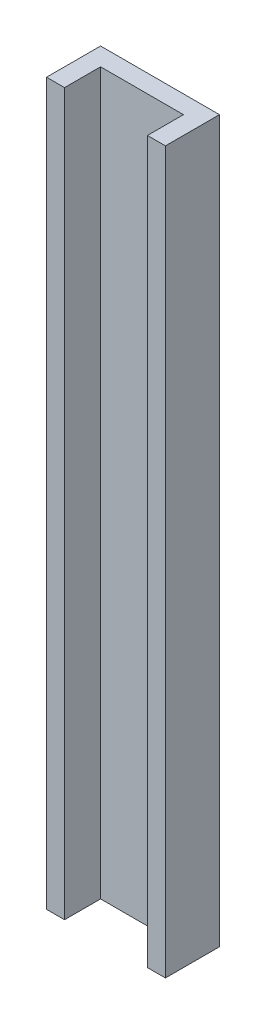
ISO-10303-21;
HEADER;
FILE_DESCRIPTION(('STEP AP214'),'2;1');
FILE_NAME('part.step','',(''),(''),'','','');
FILE_SCHEMA(('AUTOMOTIVE_DESIGN { 1 0 10303 214 1 1 1 1 }'));
ENDSEC;
DATA;
#1=APPLICATION_CONTEXT('core data for automotive mechanical design processes');
#2=APPLICATION_PROTOCOL_DEFINITION('international standard','automotive_design',2000,#1);
#3=PRODUCT_CONTEXT('',#1,'mechanical');
#4=PRODUCT('Part','Part','',(#3));
#5=PRODUCT_RELATED_PRODUCT_CATEGORY('part','',(#4));
#6=PRODUCT_DEFINITION_FORMATION('','',#4);
#7=PRODUCT_DEFINITION_CONTEXT('part definition',#1,'design');
#8=PRODUCT_DEFINITION('design','',#6,#7);
#9=PRODUCT_DEFINITION_SHAPE('','',#8);
#10=(LENGTH_UNIT() NAMED_UNIT(*) SI_UNIT(.MILLI.,.METRE.));
#11=(NAMED_UNIT(*) PLANE_ANGLE_UNIT() SI_UNIT($,.RADIAN.));
#12=(NAMED_UNIT(*) SI_UNIT($,.STERADIAN.) SOLID_ANGLE_UNIT());
#13=UNCERTAINTY_MEASURE_WITH_UNIT(LENGTH_MEASURE(1.E-05),#10,'distance_accuracy_value','');
#14=(GEOMETRIC_REPRESENTATION_CONTEXT(3) GLOBAL_UNCERTAINTY_ASSIGNED_CONTEXT((#13)) GLOBAL_UNIT_ASSIGNED_CONTEXT((#10,
#11,#12)) REPRESENTATION_CONTEXT('',''));
#15=CARTESIAN_POINT('',(0.,0.,0.));
#16=DIRECTION('',(0.,0.,1.));
#17=DIRECTION('',(1.,0.,0.));
#18=AXIS2_PLACEMENT_3D('',#15,#16,#17);
#19=CARTESIAN_POINT('',(0.,0.,5.));
#20=DIRECTION('',(0.,0.,-1.));
#21=DIRECTION('',(-1.,0.,0.));
#22=AXIS2_PLACEMENT_3D('',#19,#20,#21);
#23=PLANE('',#22);
#24=DIRECTION('',(0.,-1.,0.));
#25=VECTOR('',#24,1.);
#26=CARTESIAN_POINT('',(11.5,100.,5.));
#27=LINE('',#26,#25);
#28=CARTESIAN_POINT('',(11.5,100.,5.));
#29=VERTEX_POINT('',#28);
#30=CARTESIAN_POINT('',(11.5,-100.,5.));
#31=VERTEX_POINT('',#30);
#32=EDGE_CURVE('E55',#29,#31,#27,.T.);
#33=ORIENTED_EDGE('',*,*,#32,.F.);
#34=DIRECTION('',(-1.,0.,0.));
#35=VECTOR('',#34,1.);
#36=CARTESIAN_POINT('',(-16.5,100.,5.));
#37=LINE('',#36,#35);
#38=CARTESIAN_POINT('',(-11.5,100.,5.));
#39=VERTEX_POINT('',#38);
#40=EDGE_CURVE('E165',#29,#39,#37,.T.);
#41=ORIENTED_EDGE('',*,*,#40,.T.);
#42=DIRECTION('',(0.,1.,0.));
#43=VECTOR('',#42,1.);
#44=CARTESIAN_POINT('',(-11.5,100.,5.));
#45=LINE('',#44,#43);
#46=CARTESIAN_POINT('',(-11.5,-100.,5.));
#47=VERTEX_POINT('',#46);
#48=EDGE_CURVE('E139',#47,#39,#45,.T.);
#49=ORIENTED_EDGE('',*,*,#48,.F.);
#50=DIRECTION('',(1.,0.,0.));
#51=VECTOR('',#50,1.);
#52=CARTESIAN_POINT('',(-16.5,-100.,5.));
#53=LINE('',#52,#51);
#54=EDGE_CURVE('E60',#47,#31,#53,.T.);
#55=ORIENTED_EDGE('',*,*,#54,.T.);
#56=EDGE_LOOP('',(#33,#41,#49,#55));
#57=FACE_BOUND('',#56,.T.);
#58=ADVANCED_FACE('F39',(#57),#23,.F.);
#59=CARTESIAN_POINT('',(16.5,-100.,5.));
#60=DIRECTION('',(-1.,0.,0.));
#61=DIRECTION('',(0.,0.,1.));
#62=AXIS2_PLACEMENT_3D('',#59,#60,#61);
#63=PLANE('',#62);
#64=DIRECTION('',(0.,1.,0.));
#65=VECTOR('',#64,1.);
#66=CARTESIAN_POINT('',(16.5,-100.,0.));
#67=LINE('',#66,#65);
#68=CARTESIAN_POINT('',(16.5,-100.,0.));
#69=VERTEX_POINT('',#68);
#70=CARTESIAN_POINT('',(16.5,100.,0.));
#71=VERTEX_POINT('',#70);
#72=EDGE_CURVE('E108',#69,#71,#67,.T.);
#73=ORIENTED_EDGE('',*,*,#72,.T.);
#74=DIRECTION('',(0.,0.,-1.));
#75=VECTOR('',#74,1.);
#76=CARTESIAN_POINT('',(16.5,100.,5.));
#77=LINE('',#76,#75);
#78=CARTESIAN_POINT('',(16.5,100.,15.));
#79=VERTEX_POINT('',#78);
#80=EDGE_CURVE('E11',#79,#71,#77,.T.);
#81=ORIENTED_EDGE('',*,*,#80,.F.);
#82=DIRECTION('',(0.,1.,0.));
#83=VECTOR('',#82,1.);
#84=CARTESIAN_POINT('',(16.5,100.,15.));
#85=LINE('',#84,#83);
#86=CARTESIAN_POINT('',(16.5,-100.,15.));
#87=VERTEX_POINT('',#86);
#88=EDGE_CURVE('E106',#87,#79,#85,.T.);
#89=ORIENTED_EDGE('',*,*,#88,.F.);
#90=DIRECTION('',(0.,0.,-1.));
#91=VECTOR('',#90,1.);
#92=CARTESIAN_POINT('',(16.5,-100.,5.));
#93=LINE('',#92,#91);
#94=EDGE_CURVE('E171',#87,#69,#93,.T.);
#95=ORIENTED_EDGE('',*,*,#94,.T.);
#96=EDGE_LOOP('',(#73,#81,#89,#95));
#97=FACE_BOUND('',#96,.T.);
#98=ADVANCED_FACE('F41',(#97),#63,.F.);
#99=CARTESIAN_POINT('',(-16.5,100.,5.));
#100=DIRECTION('',(0.,-1.,0.));
#101=DIRECTION('',(0.,0.,-1.));
#102=AXIS2_PLACEMENT_3D('',#99,#100,#101);
#103=PLANE('',#102);
#104=DIRECTION('',(-1.,0.,0.));
#105=VECTOR('',#104,1.);
#106=CARTESIAN_POINT('',(-16.5,100.,0.));
#107=LINE('',#106,#105);
#108=CARTESIAN_POINT('',(-16.5,100.,0.));
#109=VERTEX_POINT('',#108);
#110=EDGE_CURVE('E174',#71,#109,#107,.T.);
#111=ORIENTED_EDGE('',*,*,#110,.T.);
#112=DIRECTION('',(0.,0.,-1.));
#113=VECTOR('',#112,1.);
#114=CARTESIAN_POINT('',(-16.5,100.,5.));
#115=LINE('',#114,#113);
#116=CARTESIAN_POINT('',(-16.5,100.,15.));
#117=VERTEX_POINT('',#116);
#118=EDGE_CURVE('E48',#117,#109,#115,.T.);
#119=ORIENTED_EDGE('',*,*,#118,.F.);
#120=DIRECTION('',(-1.,0.,0.));
#121=VECTOR('',#120,1.);
#122=CARTESIAN_POINT('',(-16.5,100.,15.));
#123=LINE('',#122,#121);
#124=CARTESIAN_POINT('',(-11.5,100.,15.));
#125=VERTEX_POINT('',#124);
#126=EDGE_CURVE('E150',#125,#117,#123,.T.);
#127=ORIENTED_EDGE('',*,*,#126,.F.);
#128=DIRECTION('',(0.,0.,-1.));
#129=VECTOR('',#128,1.);
#130=CARTESIAN_POINT('',(-11.5,100.,15.));
#131=LINE('',#130,#129);
#132=EDGE_CURVE('E154',#125,#39,#131,.T.);
#133=ORIENTED_EDGE('',*,*,#132,.T.);
#134=ORIENTED_EDGE('',*,*,#40,.F.);
#135=DIRECTION('',(0.,0.,-1.));
#136=VECTOR('',#135,1.);
#137=CARTESIAN_POINT('',(11.5,100.,15.));
#138=LINE('',#137,#136);
#139=CARTESIAN_POINT('',(11.5,100.,15.));
#140=VERTEX_POINT('',#139);
#141=EDGE_CURVE('E114',#140,#29,#138,.T.);
#142=ORIENTED_EDGE('',*,*,#141,.F.);
#143=DIRECTION('',(-1.,0.,0.));
#144=VECTOR('',#143,1.);
#145=CARTESIAN_POINT('',(16.5,100.,15.));
#146=LINE('',#145,#144);
#147=EDGE_CURVE('E111',#79,#140,#146,.T.);
#148=ORIENTED_EDGE('',*,*,#147,.F.);
#149=ORIENTED_EDGE('',*,*,#80,.T.);
#150=EDGE_LOOP('',(#111,#119,#127,#133,#134,#142,#148,#149));
#151=FACE_BOUND('',#150,.T.);
#152=ADVANCED_FACE('F112',(#151),#103,.F.);
#153=CARTESIAN_POINT('',(-16.5,-100.,5.));
#154=DIRECTION('',(1.,0.,0.));
#155=DIRECTION('',(0.,0.,-1.));
#156=AXIS2_PLACEMENT_3D('',#153,#154,#155);
#157=PLANE('',#156);
#158=DIRECTION('',(0.,-1.,0.));
#159=VECTOR('',#158,1.);
#160=CARTESIAN_POINT('',(-16.5,-100.,0.));
#161=LINE('',#160,#159);
#162=CARTESIAN_POINT('',(-16.5,-100.,0.));
#163=VERTEX_POINT('',#162);
#164=EDGE_CURVE('E177',#109,#163,#161,.T.);
#165=ORIENTED_EDGE('',*,*,#164,.T.);
#166=DIRECTION('',(0.,0.,-1.));
#167=VECTOR('',#166,1.);
#168=CARTESIAN_POINT('',(-16.5,-100.,5.));
#169=LINE('',#168,#167);
#170=CARTESIAN_POINT('',(-16.5,-100.,15.));
#171=VERTEX_POINT('',#170);
#172=EDGE_CURVE('E184',#171,#163,#169,.T.);
#173=ORIENTED_EDGE('',*,*,#172,.F.);
#174=DIRECTION('',(0.,-1.,0.));
#175=VECTOR('',#174,1.);
#176=CARTESIAN_POINT('',(-16.5,100.,15.));
#177=LINE('',#176,#175);
#178=EDGE_CURVE('E140',#117,#171,#177,.T.);
#179=ORIENTED_EDGE('',*,*,#178,.F.);
#180=ORIENTED_EDGE('',*,*,#118,.T.);
#181=EDGE_LOOP('',(#165,#173,#179,#180));
#182=FACE_BOUND('',#181,.T.);
#183=ADVANCED_FACE('F192',(#182),#157,.F.);
#184=CARTESIAN_POINT('',(-16.5,-100.,5.));
#185=DIRECTION('',(0.,1.,0.));
#186=DIRECTION('',(0.,0.,1.));
#187=AXIS2_PLACEMENT_3D('',#184,#185,#186);
#188=PLANE('',#187);
#189=DIRECTION('',(1.,0.,0.));
#190=VECTOR('',#189,1.);
#191=CARTESIAN_POINT('',(-16.5,-100.,0.));
#192=LINE('',#191,#190);
#193=EDGE_CURVE('E168',#163,#69,#192,.T.);
#194=ORIENTED_EDGE('',*,*,#193,.T.);
#195=ORIENTED_EDGE('',*,*,#94,.F.);
#196=DIRECTION('',(1.,0.,0.));
#197=VECTOR('',#196,1.);
#198=CARTESIAN_POINT('',(16.5,-100.,15.));
#199=LINE('',#198,#197);
#200=CARTESIAN_POINT('',(11.5,-100.,15.));
#201=VERTEX_POINT('',#200);
#202=EDGE_CURVE('E123',#201,#87,#199,.T.);
#203=ORIENTED_EDGE('',*,*,#202,.F.);
#204=DIRECTION('',(0.,0.,-1.));
#205=VECTOR('',#204,1.);
#206=CARTESIAN_POINT('',(11.5,-100.,15.));
#207=LINE('',#206,#205);
#208=EDGE_CURVE('E132',#201,#31,#207,.T.);
#209=ORIENTED_EDGE('',*,*,#208,.T.);
#210=ORIENTED_EDGE('',*,*,#54,.F.);
#211=DIRECTION('',(0.,0.,-1.));
#212=VECTOR('',#211,1.);
#213=CARTESIAN_POINT('',(-11.5,-100.,15.));
#214=LINE('',#213,#212);
#215=CARTESIAN_POINT('',(-11.5,-100.,15.));
#216=VERTEX_POINT('',#215);
#217=EDGE_CURVE('E161',#216,#47,#214,.T.);
#218=ORIENTED_EDGE('',*,*,#217,.F.);
#219=DIRECTION('',(1.,0.,0.));
#220=VECTOR('',#219,1.);
#221=CARTESIAN_POINT('',(-16.5,-100.,15.));
#222=LINE('',#221,#220);
#223=EDGE_CURVE('E144',#171,#216,#222,.T.);
#224=ORIENTED_EDGE('',*,*,#223,.F.);
#225=ORIENTED_EDGE('',*,*,#172,.T.);
#226=EDGE_LOOP('',(#194,#195,#203,#209,#210,#218,#224,#225));
#227=FACE_BOUND('',#226,.T.);
#228=ADVANCED_FACE('F198',(#227),#188,.F.);
#229=CARTESIAN_POINT('',(0.,0.,0.));
#230=DIRECTION('',(0.,0.,-1.));
#231=DIRECTION('',(-1.,0.,0.));
#232=AXIS2_PLACEMENT_3D('',#229,#230,#231);
#233=PLANE('',#232);
#234=ORIENTED_EDGE('',*,*,#72,.F.);
#235=ORIENTED_EDGE('',*,*,#193,.F.);
#236=ORIENTED_EDGE('',*,*,#164,.F.);
#237=ORIENTED_EDGE('',*,*,#110,.F.);
#238=EDGE_LOOP('',(#234,#235,#236,#237));
#239=FACE_BOUND('',#238,.T.);
#240=ADVANCED_FACE('F196',(#239),#233,.T.);
#241=CARTESIAN_POINT('',(-11.5,100.,15.));
#242=DIRECTION('',(-1.,0.,0.));
#243=DIRECTION('',(0.,-1.,0.));
#244=AXIS2_PLACEMENT_3D('',#241,#242,#243);
#245=PLANE('',#244);
#246=ORIENTED_EDGE('',*,*,#48,.T.);
#247=ORIENTED_EDGE('',*,*,#132,.F.);
#248=DIRECTION('',(0.,1.,0.));
#249=VECTOR('',#248,1.);
#250=CARTESIAN_POINT('',(-11.5,100.,15.));
#251=LINE('',#250,#249);
#252=EDGE_CURVE('E147',#216,#125,#251,.T.);
#253=ORIENTED_EDGE('',*,*,#252,.F.);
#254=ORIENTED_EDGE('',*,*,#217,.T.);
#255=EDGE_LOOP('',(#246,#247,#253,#254));
#256=FACE_BOUND('',#255,.T.);
#257=ADVANCED_FACE('F206',(#256),#245,.F.);
#258=CARTESIAN_POINT('',(0.,0.,15.));
#259=DIRECTION('',(0.,0.,1.));
#260=DIRECTION('',(1.,0.,0.));
#261=AXIS2_PLACEMENT_3D('',#258,#259,#260);
#262=PLANE('',#261);
#263=ORIENTED_EDGE('',*,*,#178,.T.);
#264=ORIENTED_EDGE('',*,*,#223,.T.);
#265=ORIENTED_EDGE('',*,*,#252,.T.);
#266=ORIENTED_EDGE('',*,*,#126,.T.);
#267=EDGE_LOOP('',(#263,#264,#265,#266));
#268=FACE_BOUND('',#267,.T.);
#269=ADVANCED_FACE('F203',(#268),#262,.T.);
#270=CARTESIAN_POINT('',(11.5,100.,15.));
#271=DIRECTION('',(1.,0.,0.));
#272=DIRECTION('',(0.,1.,0.));
#273=AXIS2_PLACEMENT_3D('',#270,#271,#272);
#274=PLANE('',#273);
#275=ORIENTED_EDGE('',*,*,#32,.T.);
#276=ORIENTED_EDGE('',*,*,#208,.F.);
#277=DIRECTION('',(0.,-1.,0.));
#278=VECTOR('',#277,1.);
#279=CARTESIAN_POINT('',(11.5,100.,15.));
#280=LINE('',#279,#278);
#281=EDGE_CURVE('E118',#140,#201,#280,.T.);
#282=ORIENTED_EDGE('',*,*,#281,.F.);
#283=ORIENTED_EDGE('',*,*,#141,.T.);
#284=EDGE_LOOP('',(#275,#276,#282,#283));
#285=FACE_BOUND('',#284,.T.);
#286=ADVANCED_FACE('F209',(#285),#274,.F.);
#287=CARTESIAN_POINT('',(0.,0.,15.));
#288=DIRECTION('',(0.,0.,-1.));
#289=DIRECTION('',(-1.,0.,0.));
#290=AXIS2_PLACEMENT_3D('',#287,#288,#289);
#291=PLANE('',#290);
#292=ORIENTED_EDGE('',*,*,#88,.T.);
#293=ORIENTED_EDGE('',*,*,#147,.T.);
#294=ORIENTED_EDGE('',*,*,#281,.T.);
#295=ORIENTED_EDGE('',*,*,#202,.T.);
#296=EDGE_LOOP('',(#292,#293,#294,#295));
#297=FACE_BOUND('',#296,.T.);
#298=ADVANCED_FACE('F121',(#297),#291,.F.);
#299=CLOSED_SHELL('',(#58,#98,#152,#183,#228,#240,#257,#269,#286,#298));
#300=MANIFOLD_SOLID_BREP('B2',#299);
#301=ADVANCED_BREP_SHAPE_REPRESENTATION('',(#18,#300),#14);
#302=SHAPE_DEFINITION_REPRESENTATION(#9,#301);
ENDSEC;
END-ISO-10303-21;
